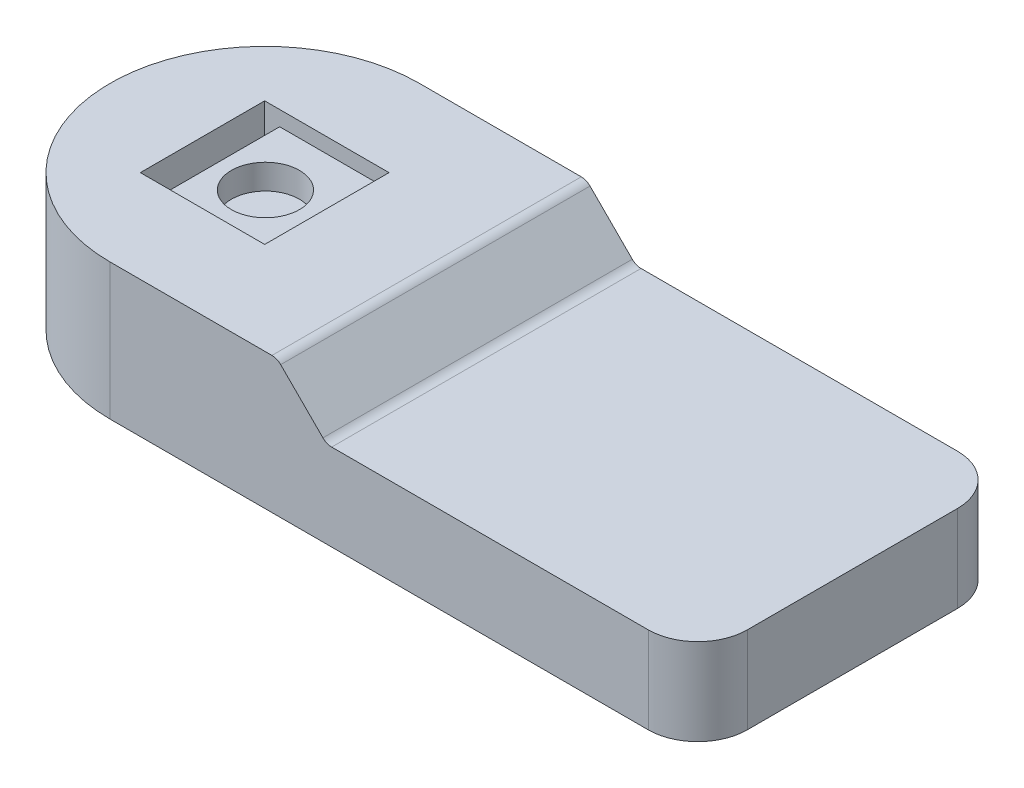
ISO-10303-21;
HEADER;
FILE_DESCRIPTION(('STEP AP214'),'2;1');
FILE_NAME('part.step','',(''),(''),'','','');
FILE_SCHEMA(('AUTOMOTIVE_DESIGN { 1 0 10303 214 1 1 1 1 }'));
ENDSEC;
DATA;
#1=APPLICATION_CONTEXT('core data for automotive mechanical design processes');
#2=APPLICATION_PROTOCOL_DEFINITION('international standard','automotive_design',2000,#1);
#3=PRODUCT_CONTEXT('',#1,'mechanical');
#4=PRODUCT('Part','Part','',(#3));
#5=PRODUCT_RELATED_PRODUCT_CATEGORY('part','',(#4));
#6=PRODUCT_DEFINITION_FORMATION('','',#4);
#7=PRODUCT_DEFINITION_CONTEXT('part definition',#1,'design');
#8=PRODUCT_DEFINITION('design','',#6,#7);
#9=PRODUCT_DEFINITION_SHAPE('','',#8);
#10=(LENGTH_UNIT() NAMED_UNIT(*) SI_UNIT(.MILLI.,.METRE.));
#11=(NAMED_UNIT(*) PLANE_ANGLE_UNIT() SI_UNIT($,.RADIAN.));
#12=(NAMED_UNIT(*) SI_UNIT($,.STERADIAN.) SOLID_ANGLE_UNIT());
#13=UNCERTAINTY_MEASURE_WITH_UNIT(LENGTH_MEASURE(1.E-05),#10,'distance_accuracy_value','');
#14=(GEOMETRIC_REPRESENTATION_CONTEXT(3) GLOBAL_UNCERTAINTY_ASSIGNED_CONTEXT((#13)) GLOBAL_UNIT_ASSIGNED_CONTEXT((#10,
#11,#12)) REPRESENTATION_CONTEXT('',''));
#15=CARTESIAN_POINT('',(0.,0.,0.));
#16=DIRECTION('',(0.,0.,1.));
#17=DIRECTION('',(1.,0.,0.));
#18=AXIS2_PLACEMENT_3D('',#15,#16,#17);
#19=CARTESIAN_POINT('',(-17.5,11.,0.));
#20=DIRECTION('',(0.,-1.,0.));
#21=DIRECTION('',(0.,0.,-1.));
#22=AXIS2_PLACEMENT_3D('',#19,#20,#21);
#23=CYLINDRICAL_SURFACE('',#22,12.5);
#24=DIRECTION('',(0.,-1.,0.));
#25=VECTOR('',#24,1.);
#26=CARTESIAN_POINT('',(-17.5,11.,12.5));
#27=LINE('',#26,#25);
#28=CARTESIAN_POINT('',(-17.5,11.,12.5));
#29=VERTEX_POINT('',#28);
#30=CARTESIAN_POINT('',(-17.5,0.,12.5));
#31=VERTEX_POINT('',#30);
#32=EDGE_CURVE('E254',#29,#31,#27,.T.);
#33=ORIENTED_EDGE('',*,*,#32,.F.);
#34=CARTESIAN_POINT('',(-17.5,11.,0.));
#35=DIRECTION('',(0.,1.,0.));
#36=DIRECTION('',(0.,0.,1.));
#37=AXIS2_PLACEMENT_3D('',#34,#35,#36);
#38=CIRCLE('',#37,12.5);
#39=CARTESIAN_POINT('',(-17.5,11.,-12.5));
#40=VERTEX_POINT('',#39);
#41=EDGE_CURVE('E264',#40,#29,#38,.T.);
#42=ORIENTED_EDGE('',*,*,#41,.F.);
#43=DIRECTION('',(0.,-1.,0.));
#44=VECTOR('',#43,1.);
#45=CARTESIAN_POINT('',(-17.5,11.,-12.5));
#46=LINE('',#45,#44);
#47=CARTESIAN_POINT('',(-17.5,0.,-12.5));
#48=VERTEX_POINT('',#47);
#49=EDGE_CURVE('E261',#48,#40,#46,.F.);
#50=ORIENTED_EDGE('',*,*,#49,.F.);
#51=CARTESIAN_POINT('',(-17.5,0.,0.));
#52=DIRECTION('',(0.,1.,0.));
#53=DIRECTION('',(0.,0.,1.));
#54=AXIS2_PLACEMENT_3D('',#51,#52,#53);
#55=CIRCLE('',#54,12.5);
#56=EDGE_CURVE('E266',#31,#48,#55,.F.);
#57=ORIENTED_EDGE('',*,*,#56,.F.);
#58=EDGE_LOOP('',(#33,#42,#50,#57));
#59=FACE_BOUND('',#58,.T.);
#60=ADVANCED_FACE('F36',(#59),#23,.T.);
#61=CARTESIAN_POINT('',(30.,11.,-12.5));
#62=DIRECTION('',(-1.,0.,0.));
#63=DIRECTION('',(0.,0.,1.));
#64=AXIS2_PLACEMENT_3D('',#61,#62,#63);
#65=PLANE('',#64);
#66=DIRECTION('',(0.,0.,-1.));
#67=VECTOR('',#66,1.);
#68=CARTESIAN_POINT('',(30.,0.,-12.5));
#69=LINE('',#68,#67);
#70=CARTESIAN_POINT('',(30.,0.,8.5));
#71=VERTEX_POINT('',#70);
#72=CARTESIAN_POINT('',(30.,0.,-8.5));
#73=VERTEX_POINT('',#72);
#74=EDGE_CURVE('E256',#71,#73,#69,.T.);
#75=ORIENTED_EDGE('',*,*,#74,.T.);
#76=DIRECTION('',(0.,-1.,0.));
#77=VECTOR('',#76,1.);
#78=CARTESIAN_POINT('',(30.,11.,-8.5));
#79=LINE('',#78,#77);
#80=CARTESIAN_POINT('',(30.,7.,-8.5));
#81=VERTEX_POINT('',#80);
#82=EDGE_CURVE('E57',#73,#81,#79,.F.);
#83=ORIENTED_EDGE('',*,*,#82,.T.);
#84=DIRECTION('',(0.,0.,-1.));
#85=VECTOR('',#84,1.);
#86=CARTESIAN_POINT('',(30.,7.,12.5));
#87=LINE('',#86,#85);
#88=CARTESIAN_POINT('',(30.,7.,8.5));
#89=VERTEX_POINT('',#88);
#90=EDGE_CURVE('E243',#89,#81,#87,.T.);
#91=ORIENTED_EDGE('',*,*,#90,.F.);
#92=DIRECTION('',(0.,-1.,0.));
#93=VECTOR('',#92,1.);
#94=CARTESIAN_POINT('',(30.,11.,8.5));
#95=LINE('',#94,#93);
#96=EDGE_CURVE('E301',#89,#71,#95,.T.);
#97=ORIENTED_EDGE('',*,*,#96,.T.);
#98=EDGE_LOOP('',(#75,#83,#91,#97));
#99=FACE_BOUND('',#98,.T.);
#100=ADVANCED_FACE('F321',(#99),#65,.F.);
#101=CARTESIAN_POINT('',(-30.,11.,12.5));
#102=DIRECTION('',(0.,0.,-1.));
#103=DIRECTION('',(-1.,0.,0.));
#104=AXIS2_PLACEMENT_3D('',#101,#102,#103);
#105=PLANE('',#104);
#106=DIRECTION('',(1.,0.,0.));
#107=VECTOR('',#106,1.);
#108=CARTESIAN_POINT('',(-30.,0.,12.5));
#109=LINE('',#108,#107);
#110=CARTESIAN_POINT('',(26.,0.,12.5));
#111=VERTEX_POINT('',#110);
#112=EDGE_CURVE('E247',#31,#111,#109,.T.);
#113=ORIENTED_EDGE('',*,*,#112,.T.);
#114=DIRECTION('',(0.,-1.,0.));
#115=VECTOR('',#114,1.);
#116=CARTESIAN_POINT('',(26.,11.,12.5));
#117=LINE('',#116,#115);
#118=CARTESIAN_POINT('',(26.,7.,12.5));
#119=VERTEX_POINT('',#118);
#120=EDGE_CURVE('E11',#111,#119,#117,.F.);
#121=ORIENTED_EDGE('',*,*,#120,.T.);
#122=DIRECTION('',(1.,0.,0.));
#123=VECTOR('',#122,1.);
#124=CARTESIAN_POINT('',(0.,7.,12.5));
#125=LINE('',#124,#123);
#126=CARTESIAN_POINT('',(0.41421356237307,7.,12.5));
#127=VERTEX_POINT('',#126);
#128=EDGE_CURVE('E235',#127,#119,#125,.T.);
#129=ORIENTED_EDGE('',*,*,#128,.F.);
#130=CARTESIAN_POINT('',(0.41421356237307,8.,12.5));
#131=DIRECTION('',(0.,0.,-1.));
#132=DIRECTION('',(-1.,0.,0.));
#133=AXIS2_PLACEMENT_3D('',#130,#131,#132);
#134=CIRCLE('',#133,1.);
#135=CARTESIAN_POINT('',(-0.292893218813478,7.29289321881345,12.5));
#136=VERTEX_POINT('',#135);
#137=EDGE_CURVE('E289',#127,#136,#134,.T.);
#138=ORIENTED_EDGE('',*,*,#137,.T.);
#139=DIRECTION('',(-0.707106781186548,0.707106781186548,0.));
#140=VECTOR('',#139,1.);
#141=CARTESIAN_POINT('',(0.,6.99999999999998,12.5));
#142=LINE('',#141,#140);
#143=CARTESIAN_POINT('',(-3.70710678118657,10.7071067811865,12.5));
#144=VERTEX_POINT('',#143);
#145=EDGE_CURVE('E269',#136,#144,#142,.T.);
#146=ORIENTED_EDGE('',*,*,#145,.T.);
#147=CARTESIAN_POINT('',(-4.41421356237312,10.,12.5));
#148=DIRECTION('',(0.,0.,-1.));
#149=DIRECTION('',(-1.,0.,0.));
#150=AXIS2_PLACEMENT_3D('',#147,#148,#149);
#151=CIRCLE('',#150,1.);
#152=CARTESIAN_POINT('',(-4.41421356237312,11.,12.5));
#153=VERTEX_POINT('',#152);
#154=EDGE_CURVE('E287',#144,#153,#151,.F.);
#155=ORIENTED_EDGE('',*,*,#154,.T.);
#156=DIRECTION('',(1.,0.,0.));
#157=VECTOR('',#156,1.);
#158=CARTESIAN_POINT('',(-30.,11.,12.5));
#159=LINE('',#158,#157);
#160=EDGE_CURVE('E248',#29,#153,#159,.T.);
#161=ORIENTED_EDGE('',*,*,#160,.F.);
#162=ORIENTED_EDGE('',*,*,#32,.T.);
#163=EDGE_LOOP('',(#113,#121,#129,#138,#146,#155,#161,#162));
#164=FACE_BOUND('',#163,.T.);
#165=ADVANCED_FACE('F326',(#164),#105,.F.);
#166=CARTESIAN_POINT('',(-30.,11.,-12.5));
#167=DIRECTION('',(0.,0.,1.));
#168=DIRECTION('',(1.,0.,0.));
#169=AXIS2_PLACEMENT_3D('',#166,#167,#168);
#170=PLANE('',#169);
#171=DIRECTION('',(-1.,0.,0.));
#172=VECTOR('',#171,1.);
#173=CARTESIAN_POINT('',(30.,7.,-12.5));
#174=LINE('',#173,#172);
#175=CARTESIAN_POINT('',(26.,7.,-12.5));
#176=VERTEX_POINT('',#175);
#177=CARTESIAN_POINT('',(0.414213562373061,7.,-12.5));
#178=VERTEX_POINT('',#177);
#179=EDGE_CURVE('E245',#176,#178,#174,.T.);
#180=ORIENTED_EDGE('',*,*,#179,.F.);
#181=DIRECTION('',(0.,-1.,0.));
#182=VECTOR('',#181,1.);
#183=CARTESIAN_POINT('',(26.,11.,-12.5));
#184=LINE('',#183,#182);
#185=CARTESIAN_POINT('',(26.,0.,-12.5));
#186=VERTEX_POINT('',#185);
#187=EDGE_CURVE('E294',#176,#186,#184,.T.);
#188=ORIENTED_EDGE('',*,*,#187,.T.);
#189=DIRECTION('',(-1.,0.,0.));
#190=VECTOR('',#189,1.);
#191=CARTESIAN_POINT('',(-30.,0.,-12.5));
#192=LINE('',#191,#190);
#193=EDGE_CURVE('E252',#186,#48,#192,.T.);
#194=ORIENTED_EDGE('',*,*,#193,.T.);
#195=ORIENTED_EDGE('',*,*,#49,.T.);
#196=DIRECTION('',(-1.,0.,0.));
#197=VECTOR('',#196,1.);
#198=CARTESIAN_POINT('',(-30.,11.,-12.5));
#199=LINE('',#198,#197);
#200=CARTESIAN_POINT('',(-4.41421356237313,11.,-12.5));
#201=VERTEX_POINT('',#200);
#202=EDGE_CURVE('E251',#201,#40,#199,.T.);
#203=ORIENTED_EDGE('',*,*,#202,.F.);
#204=CARTESIAN_POINT('',(-4.41421356237313,10.,-12.5));
#205=DIRECTION('',(0.,0.,1.));
#206=DIRECTION('',(1.,0.,0.));
#207=AXIS2_PLACEMENT_3D('',#204,#205,#206);
#208=CIRCLE('',#207,1.);
#209=CARTESIAN_POINT('',(-3.70710678118658,10.7071067811865,-12.5));
#210=VERTEX_POINT('',#209);
#211=EDGE_CURVE('E285',#201,#210,#208,.F.);
#212=ORIENTED_EDGE('',*,*,#211,.T.);
#213=DIRECTION('',(0.707106781186548,-0.707106781186548,0.));
#214=VECTOR('',#213,1.);
#215=CARTESIAN_POINT('',(0.,6.99999999999998,-12.5));
#216=LINE('',#215,#214);
#217=CARTESIAN_POINT('',(-0.292893218813485,7.29289321881345,-12.5));
#218=VERTEX_POINT('',#217);
#219=EDGE_CURVE('E272',#210,#218,#216,.T.);
#220=ORIENTED_EDGE('',*,*,#219,.T.);
#221=CARTESIAN_POINT('',(0.414213562373063,8.,-12.5));
#222=DIRECTION('',(0.,0.,1.));
#223=DIRECTION('',(1.,0.,0.));
#224=AXIS2_PLACEMENT_3D('',#221,#222,#223);
#225=CIRCLE('',#224,1.);
#226=EDGE_CURVE('E291',#218,#178,#225,.T.);
#227=ORIENTED_EDGE('',*,*,#226,.T.);
#228=EDGE_LOOP('',(#180,#188,#194,#195,#203,#212,#220,#227));
#229=FACE_BOUND('',#228,.T.);
#230=ADVANCED_FACE('F313',(#229),#170,.F.);
#231=CARTESIAN_POINT('',(0.,11.,0.));
#232=DIRECTION('',(0.,1.,0.));
#233=DIRECTION('',(0.,0.,1.));
#234=AXIS2_PLACEMENT_3D('',#231,#232,#233);
#235=PLANE('',#234);
#236=DIRECTION('',(0.,0.,1.));
#237=VECTOR('',#236,1.);
#238=CARTESIAN_POINT('',(-22.525,11.,-5.025));
#239=LINE('',#238,#237);
#240=CARTESIAN_POINT('',(-22.525,11.,-5.025));
#241=VERTEX_POINT('',#240);
#242=CARTESIAN_POINT('',(-22.525,11.,5.025));
#243=VERTEX_POINT('',#242);
#244=EDGE_CURVE('E198',#241,#243,#239,.T.);
#245=ORIENTED_EDGE('',*,*,#244,.F.);
#246=DIRECTION('',(-1.,0.,0.));
#247=VECTOR('',#246,1.);
#248=CARTESIAN_POINT('',(-22.525,11.,-5.025));
#249=LINE('',#248,#247);
#250=CARTESIAN_POINT('',(-12.475,11.,-5.025));
#251=VERTEX_POINT('',#250);
#252=EDGE_CURVE('E222',#251,#241,#249,.T.);
#253=ORIENTED_EDGE('',*,*,#252,.F.);
#254=DIRECTION('',(0.,0.,-1.));
#255=VECTOR('',#254,1.);
#256=CARTESIAN_POINT('',(-12.475,11.,-5.025));
#257=LINE('',#256,#255);
#258=CARTESIAN_POINT('',(-12.475,11.,5.025));
#259=VERTEX_POINT('',#258);
#260=EDGE_CURVE('E229',#259,#251,#257,.T.);
#261=ORIENTED_EDGE('',*,*,#260,.F.);
#262=DIRECTION('',(1.,0.,0.));
#263=VECTOR('',#262,1.);
#264=CARTESIAN_POINT('',(-22.525,11.,5.025));
#265=LINE('',#264,#263);
#266=EDGE_CURVE('E226',#243,#259,#265,.T.);
#267=ORIENTED_EDGE('',*,*,#266,.F.);
#268=EDGE_LOOP('',(#245,#253,#261,#267));
#269=FACE_BOUND('',#268,.T.);
#270=ORIENTED_EDGE('',*,*,#160,.T.);
#271=DIRECTION('',(0.,0.,-1.));
#272=VECTOR('',#271,1.);
#273=CARTESIAN_POINT('',(-4.41421356237312,11.,0.));
#274=LINE('',#273,#272);
#275=EDGE_CURVE('E282',#153,#201,#274,.T.);
#276=ORIENTED_EDGE('',*,*,#275,.T.);
#277=ORIENTED_EDGE('',*,*,#202,.T.);
#278=ORIENTED_EDGE('',*,*,#41,.T.);
#279=EDGE_LOOP('',(#270,#276,#277,#278));
#280=FACE_BOUND('',#279,.T.);
#281=ADVANCED_FACE('F335',(#269,#280),#235,.T.);
#282=CARTESIAN_POINT('',(0.,0.,0.));
#283=DIRECTION('',(0.,1.,0.));
#284=DIRECTION('',(0.,0.,1.));
#285=AXIS2_PLACEMENT_3D('',#282,#283,#284);
#286=PLANE('',#285);
#287=ORIENTED_EDGE('',*,*,#193,.F.);
#288=CARTESIAN_POINT('',(26.,0.,-8.5));
#289=DIRECTION('',(0.,1.,0.));
#290=DIRECTION('',(0.,0.,1.));
#291=AXIS2_PLACEMENT_3D('',#288,#289,#290);
#292=CIRCLE('',#291,4.);
#293=EDGE_CURVE('E299',#186,#73,#292,.F.);
#294=ORIENTED_EDGE('',*,*,#293,.T.);
#295=ORIENTED_EDGE('',*,*,#74,.F.);
#296=CARTESIAN_POINT('',(26.,0.,8.5));
#297=DIRECTION('',(0.,1.,0.));
#298=DIRECTION('',(0.,0.,1.));
#299=AXIS2_PLACEMENT_3D('',#296,#297,#298);
#300=CIRCLE('',#299,4.);
#301=EDGE_CURVE('E297',#71,#111,#300,.F.);
#302=ORIENTED_EDGE('',*,*,#301,.T.);
#303=ORIENTED_EDGE('',*,*,#112,.F.);
#304=ORIENTED_EDGE('',*,*,#56,.T.);
#305=EDGE_LOOP('',(#287,#294,#295,#302,#303,#304));
#306=FACE_BOUND('',#305,.T.);
#307=ADVANCED_FACE('F320',(#306),#286,.F.);
#308=CARTESIAN_POINT('',(0.,7.,0.));
#309=DIRECTION('',(0.,1.,0.));
#310=DIRECTION('',(0.,0.,1.));
#311=AXIS2_PLACEMENT_3D('',#308,#309,#310);
#312=PLANE('',#311);
#313=ORIENTED_EDGE('',*,*,#90,.T.);
#314=CARTESIAN_POINT('',(26.,7.,-8.5));
#315=DIRECTION('',(0.,1.,0.));
#316=DIRECTION('',(0.,0.,1.));
#317=AXIS2_PLACEMENT_3D('',#314,#315,#316);
#318=CIRCLE('',#317,4.);
#319=EDGE_CURVE('E44',#81,#176,#318,.T.);
#320=ORIENTED_EDGE('',*,*,#319,.T.);
#321=ORIENTED_EDGE('',*,*,#179,.T.);
#322=DIRECTION('',(0.,0.,1.));
#323=VECTOR('',#322,1.);
#324=CARTESIAN_POINT('',(0.41421356237307,7.,12.5));
#325=LINE('',#324,#323);
#326=EDGE_CURVE('E275',#178,#127,#325,.T.);
#327=ORIENTED_EDGE('',*,*,#326,.T.);
#328=ORIENTED_EDGE('',*,*,#128,.T.);
#329=CARTESIAN_POINT('',(26.,7.,8.5));
#330=DIRECTION('',(0.,1.,0.));
#331=DIRECTION('',(0.,0.,1.));
#332=AXIS2_PLACEMENT_3D('',#329,#330,#331);
#333=CIRCLE('',#332,4.);
#334=EDGE_CURVE('E305',#119,#89,#333,.T.);
#335=ORIENTED_EDGE('',*,*,#334,.T.);
#336=EDGE_LOOP('',(#313,#320,#321,#327,#328,#335));
#337=FACE_BOUND('',#336,.T.);
#338=ADVANCED_FACE('F309',(#337),#312,.T.);
#339=CARTESIAN_POINT('',(-22.525,9.79,-5.025));
#340=DIRECTION('',(-1.,0.,0.));
#341=DIRECTION('',(0.,0.,1.));
#342=AXIS2_PLACEMENT_3D('',#339,#340,#341);
#343=PLANE('',#342);
#344=ORIENTED_EDGE('',*,*,#244,.T.);
#345=DIRECTION('',(0.,1.,0.));
#346=VECTOR('',#345,1.);
#347=CARTESIAN_POINT('',(-22.525,9.79,5.025));
#348=LINE('',#347,#346);
#349=CARTESIAN_POINT('',(-22.525,7.77,5.025));
#350=VERTEX_POINT('',#349);
#351=EDGE_CURVE('E224',#350,#243,#348,.T.);
#352=ORIENTED_EDGE('',*,*,#351,.F.);
#353=DIRECTION('',(0.,0.,1.));
#354=VECTOR('',#353,1.);
#355=CARTESIAN_POINT('',(-22.525,7.77,5.025));
#356=LINE('',#355,#354);
#357=CARTESIAN_POINT('',(-22.525,7.77,-5.025));
#358=VERTEX_POINT('',#357);
#359=EDGE_CURVE('E200',#358,#350,#356,.T.);
#360=ORIENTED_EDGE('',*,*,#359,.F.);
#361=DIRECTION('',(0.,1.,0.));
#362=VECTOR('',#361,1.);
#363=CARTESIAN_POINT('',(-22.525,9.79,-5.025));
#364=LINE('',#363,#362);
#365=EDGE_CURVE('E233',#358,#241,#364,.T.);
#366=ORIENTED_EDGE('',*,*,#365,.T.);
#367=EDGE_LOOP('',(#344,#352,#360,#366));
#368=FACE_BOUND('',#367,.T.);
#369=ADVANCED_FACE('F377',(#368),#343,.F.);
#370=CARTESIAN_POINT('',(-22.525,9.79,-5.025));
#371=DIRECTION('',(0.,0.,-1.));
#372=DIRECTION('',(-1.,0.,0.));
#373=AXIS2_PLACEMENT_3D('',#370,#371,#372);
#374=PLANE('',#373);
#375=ORIENTED_EDGE('',*,*,#252,.T.);
#376=ORIENTED_EDGE('',*,*,#365,.F.);
#377=DIRECTION('',(-1.,0.,0.));
#378=VECTOR('',#377,1.);
#379=CARTESIAN_POINT('',(-22.525,7.77,-5.025));
#380=LINE('',#379,#378);
#381=CARTESIAN_POINT('',(-21.315,7.77,-5.025));
#382=VERTEX_POINT('',#381);
#383=EDGE_CURVE('E210',#382,#358,#380,.T.);
#384=ORIENTED_EDGE('',*,*,#383,.F.);
#385=DIRECTION('',(0.,1.,0.));
#386=VECTOR('',#385,1.);
#387=CARTESIAN_POINT('',(-21.315,7.77,-5.025));
#388=LINE('',#387,#386);
#389=CARTESIAN_POINT('',(-21.315,9.79,-5.025));
#390=VERTEX_POINT('',#389);
#391=EDGE_CURVE('E190',#382,#390,#388,.T.);
#392=ORIENTED_EDGE('',*,*,#391,.T.);
#393=DIRECTION('',(-1.,0.,0.));
#394=VECTOR('',#393,1.);
#395=CARTESIAN_POINT('',(-22.525,9.79,-5.025));
#396=LINE('',#395,#394);
#397=CARTESIAN_POINT('',(-13.685,9.79,-5.025));
#398=VERTEX_POINT('',#397);
#399=EDGE_CURVE('E171',#398,#390,#396,.T.);
#400=ORIENTED_EDGE('',*,*,#399,.F.);
#401=DIRECTION('',(0.,1.,0.));
#402=VECTOR('',#401,1.);
#403=CARTESIAN_POINT('',(-13.685,7.77,-5.025));
#404=LINE('',#403,#402);
#405=CARTESIAN_POINT('',(-13.685,7.77,-5.025));
#406=VERTEX_POINT('',#405);
#407=EDGE_CURVE('E163',#406,#398,#404,.T.);
#408=ORIENTED_EDGE('',*,*,#407,.F.);
#409=DIRECTION('',(-1.,0.,0.));
#410=VECTOR('',#409,1.);
#411=CARTESIAN_POINT('',(-12.475,7.77,-5.025));
#412=LINE('',#411,#410);
#413=CARTESIAN_POINT('',(-12.475,7.77,-5.025));
#414=VERTEX_POINT('',#413);
#415=EDGE_CURVE('E168',#414,#406,#412,.T.);
#416=ORIENTED_EDGE('',*,*,#415,.F.);
#417=DIRECTION('',(0.,1.,0.));
#418=VECTOR('',#417,1.);
#419=CARTESIAN_POINT('',(-12.475,9.79,-5.025));
#420=LINE('',#419,#418);
#421=EDGE_CURVE('E236',#414,#251,#420,.T.);
#422=ORIENTED_EDGE('',*,*,#421,.T.);
#423=EDGE_LOOP('',(#375,#376,#384,#392,#400,#408,#416,#422));
#424=FACE_BOUND('',#423,.T.);
#425=ADVANCED_FACE('F166',(#424),#374,.F.);
#426=CARTESIAN_POINT('',(-12.475,9.79,-5.025));
#427=DIRECTION('',(1.,0.,0.));
#428=DIRECTION('',(0.,0.,-1.));
#429=AXIS2_PLACEMENT_3D('',#426,#427,#428);
#430=PLANE('',#429);
#431=ORIENTED_EDGE('',*,*,#260,.T.);
#432=ORIENTED_EDGE('',*,*,#421,.F.);
#433=DIRECTION('',(0.,0.,-1.));
#434=VECTOR('',#433,1.);
#435=CARTESIAN_POINT('',(-12.475,7.77,5.025));
#436=LINE('',#435,#434);
#437=CARTESIAN_POINT('',(-12.475,7.77,5.025));
#438=VERTEX_POINT('',#437);
#439=EDGE_CURVE('E176',#438,#414,#436,.T.);
#440=ORIENTED_EDGE('',*,*,#439,.F.);
#441=DIRECTION('',(0.,1.,0.));
#442=VECTOR('',#441,1.);
#443=CARTESIAN_POINT('',(-12.475,9.79,5.025));
#444=LINE('',#443,#442);
#445=EDGE_CURVE('E238',#438,#259,#444,.T.);
#446=ORIENTED_EDGE('',*,*,#445,.T.);
#447=EDGE_LOOP('',(#431,#432,#440,#446));
#448=FACE_BOUND('',#447,.T.);
#449=ADVANCED_FACE('F385',(#448),#430,.F.);
#450=CARTESIAN_POINT('',(-22.525,9.79,5.025));
#451=DIRECTION('',(0.,0.,1.));
#452=DIRECTION('',(1.,0.,0.));
#453=AXIS2_PLACEMENT_3D('',#450,#451,#452);
#454=PLANE('',#453);
#455=ORIENTED_EDGE('',*,*,#266,.T.);
#456=ORIENTED_EDGE('',*,*,#445,.F.);
#457=DIRECTION('',(1.,0.,0.));
#458=VECTOR('',#457,1.);
#459=CARTESIAN_POINT('',(-13.685,7.77,5.025));
#460=LINE('',#459,#458);
#461=CARTESIAN_POINT('',(-13.685,7.77,5.025));
#462=VERTEX_POINT('',#461);
#463=EDGE_CURVE('E184',#462,#438,#460,.T.);
#464=ORIENTED_EDGE('',*,*,#463,.F.);
#465=DIRECTION('',(0.,1.,0.));
#466=VECTOR('',#465,1.);
#467=CARTESIAN_POINT('',(-13.685,7.77,5.025));
#468=LINE('',#467,#466);
#469=CARTESIAN_POINT('',(-13.685,9.79,5.025));
#470=VERTEX_POINT('',#469);
#471=EDGE_CURVE('E175',#462,#470,#468,.T.);
#472=ORIENTED_EDGE('',*,*,#471,.T.);
#473=DIRECTION('',(1.,0.,0.));
#474=VECTOR('',#473,1.);
#475=CARTESIAN_POINT('',(-22.525,9.79,5.025));
#476=LINE('',#475,#474);
#477=CARTESIAN_POINT('',(-21.315,9.79,5.025));
#478=VERTEX_POINT('',#477);
#479=EDGE_CURVE('E219',#478,#470,#476,.T.);
#480=ORIENTED_EDGE('',*,*,#479,.F.);
#481=DIRECTION('',(0.,1.,0.));
#482=VECTOR('',#481,1.);
#483=CARTESIAN_POINT('',(-21.315,7.77,5.025));
#484=LINE('',#483,#482);
#485=CARTESIAN_POINT('',(-21.315,7.77,5.025));
#486=VERTEX_POINT('',#485);
#487=EDGE_CURVE('E213',#486,#478,#484,.T.);
#488=ORIENTED_EDGE('',*,*,#487,.F.);
#489=DIRECTION('',(1.,0.,0.));
#490=VECTOR('',#489,1.);
#491=CARTESIAN_POINT('',(-21.315,7.77,5.025));
#492=LINE('',#491,#490);
#493=EDGE_CURVE('E203',#350,#486,#492,.T.);
#494=ORIENTED_EDGE('',*,*,#493,.F.);
#495=ORIENTED_EDGE('',*,*,#351,.T.);
#496=EDGE_LOOP('',(#455,#456,#464,#472,#480,#488,#494,#495));
#497=FACE_BOUND('',#496,.T.);
#498=ADVANCED_FACE('F381',(#497),#454,.F.);
#499=CARTESIAN_POINT('',(0.,9.79,0.));
#500=DIRECTION('',(0.,1.,0.));
#501=DIRECTION('',(0.,0.,1.));
#502=AXIS2_PLACEMENT_3D('',#499,#500,#501);
#503=PLANE('',#502);
#504=CARTESIAN_POINT('',(-17.465,9.79,-0.0250000000000007));
#505=DIRECTION('',(0.,1.,0.));
#506=DIRECTION('',(0.,0.,1.));
#507=AXIS2_PLACEMENT_3D('',#504,#505,#506);
#508=CIRCLE('',#507,2.75);
#509=CARTESIAN_POINT('',(-17.465,9.79,2.725));
#510=VERTEX_POINT('',#509);
#511=EDGE_CURVE('E193',#510,#510,#508,.T.);
#512=ORIENTED_EDGE('',*,*,#511,.F.);
#513=EDGE_LOOP('',(#512));
#514=FACE_BOUND('',#513,.T.);
#515=DIRECTION('',(0.,0.,1.));
#516=VECTOR('',#515,1.);
#517=CARTESIAN_POINT('',(-13.685,9.79,-5.025));
#518=LINE('',#517,#516);
#519=EDGE_CURVE('E188',#398,#470,#518,.T.);
#520=ORIENTED_EDGE('',*,*,#519,.F.);
#521=ORIENTED_EDGE('',*,*,#399,.T.);
#522=DIRECTION('',(0.,0.,-1.));
#523=VECTOR('',#522,1.);
#524=CARTESIAN_POINT('',(-21.315,9.79,-5.025));
#525=LINE('',#524,#523);
#526=EDGE_CURVE('E204',#478,#390,#525,.T.);
#527=ORIENTED_EDGE('',*,*,#526,.F.);
#528=ORIENTED_EDGE('',*,*,#479,.T.);
#529=EDGE_LOOP('',(#520,#521,#527,#528));
#530=FACE_BOUND('',#529,.T.);
#531=ADVANCED_FACE('F384',(#514,#530),#503,.T.);
#532=CARTESIAN_POINT('',(-21.315,7.77,-5.025));
#533=DIRECTION('',(1.,0.,0.));
#534=DIRECTION('',(0.,0.,-1.));
#535=AXIS2_PLACEMENT_3D('',#532,#533,#534);
#536=PLANE('',#535);
#537=ORIENTED_EDGE('',*,*,#526,.T.);
#538=ORIENTED_EDGE('',*,*,#391,.F.);
#539=DIRECTION('',(0.,0.,-1.));
#540=VECTOR('',#539,1.);
#541=CARTESIAN_POINT('',(-21.315,7.77,-5.025));
#542=LINE('',#541,#540);
#543=EDGE_CURVE('E207',#486,#382,#542,.T.);
#544=ORIENTED_EDGE('',*,*,#543,.F.);
#545=ORIENTED_EDGE('',*,*,#487,.T.);
#546=EDGE_LOOP('',(#537,#538,#544,#545));
#547=FACE_BOUND('',#546,.T.);
#548=ADVANCED_FACE('F394',(#547),#536,.F.);
#549=CARTESIAN_POINT('',(0.,7.77,0.));
#550=DIRECTION('',(0.,-1.,0.));
#551=DIRECTION('',(0.,0.,-1.));
#552=AXIS2_PLACEMENT_3D('',#549,#550,#551);
#553=PLANE('',#552);
#554=ORIENTED_EDGE('',*,*,#359,.T.);
#555=ORIENTED_EDGE('',*,*,#493,.T.);
#556=ORIENTED_EDGE('',*,*,#543,.T.);
#557=ORIENTED_EDGE('',*,*,#383,.T.);
#558=EDGE_LOOP('',(#554,#555,#556,#557));
#559=FACE_BOUND('',#558,.T.);
#560=ADVANCED_FACE('F398',(#559),#553,.F.);
#561=CARTESIAN_POINT('',(-13.685,7.77,-5.025));
#562=DIRECTION('',(-1.,0.,0.));
#563=DIRECTION('',(0.,0.,1.));
#564=AXIS2_PLACEMENT_3D('',#561,#562,#563);
#565=PLANE('',#564);
#566=ORIENTED_EDGE('',*,*,#519,.T.);
#567=ORIENTED_EDGE('',*,*,#471,.F.);
#568=DIRECTION('',(0.,0.,1.));
#569=VECTOR('',#568,1.);
#570=CARTESIAN_POINT('',(-13.685,7.77,-5.025));
#571=LINE('',#570,#569);
#572=EDGE_CURVE('E179',#406,#462,#571,.T.);
#573=ORIENTED_EDGE('',*,*,#572,.F.);
#574=ORIENTED_EDGE('',*,*,#407,.T.);
#575=EDGE_LOOP('',(#566,#567,#573,#574));
#576=FACE_BOUND('',#575,.T.);
#577=ADVANCED_FACE('F180',(#576),#565,.F.);
#578=CARTESIAN_POINT('',(0.,7.77,0.));
#579=DIRECTION('',(0.,1.,0.));
#580=DIRECTION('',(0.,0.,1.));
#581=AXIS2_PLACEMENT_3D('',#578,#579,#580);
#582=PLANE('',#581);
#583=ORIENTED_EDGE('',*,*,#415,.T.);
#584=ORIENTED_EDGE('',*,*,#572,.T.);
#585=ORIENTED_EDGE('',*,*,#463,.T.);
#586=ORIENTED_EDGE('',*,*,#439,.T.);
#587=EDGE_LOOP('',(#583,#584,#585,#586));
#588=FACE_BOUND('',#587,.T.);
#589=ADVANCED_FACE('F186',(#588),#582,.T.);
#590=CARTESIAN_POINT('',(-17.465,7.77,-0.0250000000000007));
#591=DIRECTION('',(0.,1.,0.));
#592=DIRECTION('',(0.,0.,1.));
#593=AXIS2_PLACEMENT_3D('',#590,#591,#592);
#594=CYLINDRICAL_SURFACE('',#593,2.75);
#595=CARTESIAN_POINT('',(-17.465,7.77,-0.0250000000000007));
#596=DIRECTION('',(0.,1.,0.));
#597=DIRECTION('',(0.,0.,1.));
#598=AXIS2_PLACEMENT_3D('',#595,#596,#597);
#599=CIRCLE('',#598,2.75);
#600=CARTESIAN_POINT('',(-17.465,7.77,2.725));
#601=VERTEX_POINT('',#600);
#602=EDGE_CURVE('E216',#601,#601,#599,.T.);
#603=ORIENTED_EDGE('',*,*,#602,.F.);
#604=EDGE_LOOP('',(#603));
#605=FACE_BOUND('',#604,.T.);
#606=ORIENTED_EDGE('',*,*,#511,.T.);
#607=EDGE_LOOP('',(#606));
#608=FACE_BOUND('',#607,.T.);
#609=ADVANCED_FACE('F407',(#605,#608),#594,.F.);
#610=CARTESIAN_POINT('',(-17.465,7.77,-0.0250000000000007));
#611=DIRECTION('',(0.,1.,0.));
#612=DIRECTION('',(0.,0.,1.));
#613=AXIS2_PLACEMENT_3D('',#610,#611,#612);
#614=PLANE('',#613);
#615=ORIENTED_EDGE('',*,*,#602,.T.);
#616=EDGE_LOOP('',(#615));
#617=FACE_BOUND('',#616,.T.);
#618=ADVANCED_FACE('F354',(#617),#614,.T.);
#619=CARTESIAN_POINT('',(0.,6.99999999999998,-12.5));
#620=DIRECTION('',(0.707106781186548,0.707106781186548,0.));
#621=DIRECTION('',(0.,0.,-1.));
#622=AXIS2_PLACEMENT_3D('',#619,#620,#621);
#623=PLANE('',#622);
#624=ORIENTED_EDGE('',*,*,#145,.F.);
#625=DIRECTION('',(0.,0.,1.));
#626=VECTOR('',#625,1.);
#627=CARTESIAN_POINT('',(-0.292893218813485,7.29289321881345,-12.5));
#628=LINE('',#627,#626);
#629=EDGE_CURVE('E280',#136,#218,#628,.F.);
#630=ORIENTED_EDGE('',*,*,#629,.T.);
#631=ORIENTED_EDGE('',*,*,#219,.F.);
#632=DIRECTION('',(0.,0.,-1.));
#633=VECTOR('',#632,1.);
#634=CARTESIAN_POINT('',(-3.70710678118658,10.7071067811865,-12.5));
#635=LINE('',#634,#633);
#636=EDGE_CURVE('E278',#210,#144,#635,.F.);
#637=ORIENTED_EDGE('',*,*,#636,.T.);
#638=EDGE_LOOP('',(#624,#630,#631,#637));
#639=FACE_BOUND('',#638,.T.);
#640=ADVANCED_FACE('F343',(#639),#623,.T.);
#641=CARTESIAN_POINT('',(0.414213562373067,8.,0.));
#642=DIRECTION('',(0.,0.,-1.));
#643=DIRECTION('',(-1.,0.,0.));
#644=AXIS2_PLACEMENT_3D('',#641,#642,#643);
#645=CYLINDRICAL_SURFACE('',#644,1.);
#646=ORIENTED_EDGE('',*,*,#226,.F.);
#647=ORIENTED_EDGE('',*,*,#629,.F.);
#648=ORIENTED_EDGE('',*,*,#137,.F.);
#649=ORIENTED_EDGE('',*,*,#326,.F.);
#650=EDGE_LOOP('',(#646,#647,#648,#649));
#651=FACE_BOUND('',#650,.T.);
#652=ADVANCED_FACE('F346',(#651),#645,.F.);
#653=CARTESIAN_POINT('',(-4.41421356237312,10.,0.));
#654=DIRECTION('',(0.,0.,-1.));
#655=DIRECTION('',(-1.,0.,0.));
#656=AXIS2_PLACEMENT_3D('',#653,#654,#655);
#657=CYLINDRICAL_SURFACE('',#656,1.);
#658=ORIENTED_EDGE('',*,*,#154,.F.);
#659=ORIENTED_EDGE('',*,*,#636,.F.);
#660=ORIENTED_EDGE('',*,*,#211,.F.);
#661=ORIENTED_EDGE('',*,*,#275,.F.);
#662=EDGE_LOOP('',(#658,#659,#660,#661));
#663=FACE_BOUND('',#662,.T.);
#664=ADVANCED_FACE('F339',(#663),#657,.T.);
#665=CARTESIAN_POINT('',(26.,11.,-8.5));
#666=DIRECTION('',(0.,-1.,0.));
#667=DIRECTION('',(0.,0.,-1.));
#668=AXIS2_PLACEMENT_3D('',#665,#666,#667);
#669=CYLINDRICAL_SURFACE('',#668,4.);
#670=ORIENTED_EDGE('',*,*,#319,.F.);
#671=ORIENTED_EDGE('',*,*,#82,.F.);
#672=ORIENTED_EDGE('',*,*,#293,.F.);
#673=ORIENTED_EDGE('',*,*,#187,.F.);
#674=EDGE_LOOP('',(#670,#671,#672,#673));
#675=FACE_BOUND('',#674,.T.);
#676=ADVANCED_FACE('F317',(#675),#669,.T.);
#677=CARTESIAN_POINT('',(26.,11.,8.5));
#678=DIRECTION('',(0.,-1.,0.));
#679=DIRECTION('',(0.,0.,-1.));
#680=AXIS2_PLACEMENT_3D('',#677,#678,#679);
#681=CYLINDRICAL_SURFACE('',#680,4.);
#682=ORIENTED_EDGE('',*,*,#334,.F.);
#683=ORIENTED_EDGE('',*,*,#120,.F.);
#684=ORIENTED_EDGE('',*,*,#301,.F.);
#685=ORIENTED_EDGE('',*,*,#96,.F.);
#686=EDGE_LOOP('',(#682,#683,#684,#685));
#687=FACE_BOUND('',#686,.T.);
#688=ADVANCED_FACE('F38',(#687),#681,.T.);
#689=CLOSED_SHELL('',(#60,#100,#165,#230,#281,#307,#338,#369,#425,#449,#498,#531,#548,#560,#577,
#589,#609,#618,#640,#652,#664,#676,#688));
#690=MANIFOLD_SOLID_BREP('B2',#689);
#691=ADVANCED_BREP_SHAPE_REPRESENTATION('',(#18,#690),#14);
#692=SHAPE_DEFINITION_REPRESENTATION(#9,#691);
ENDSEC;
END-ISO-10303-21;
